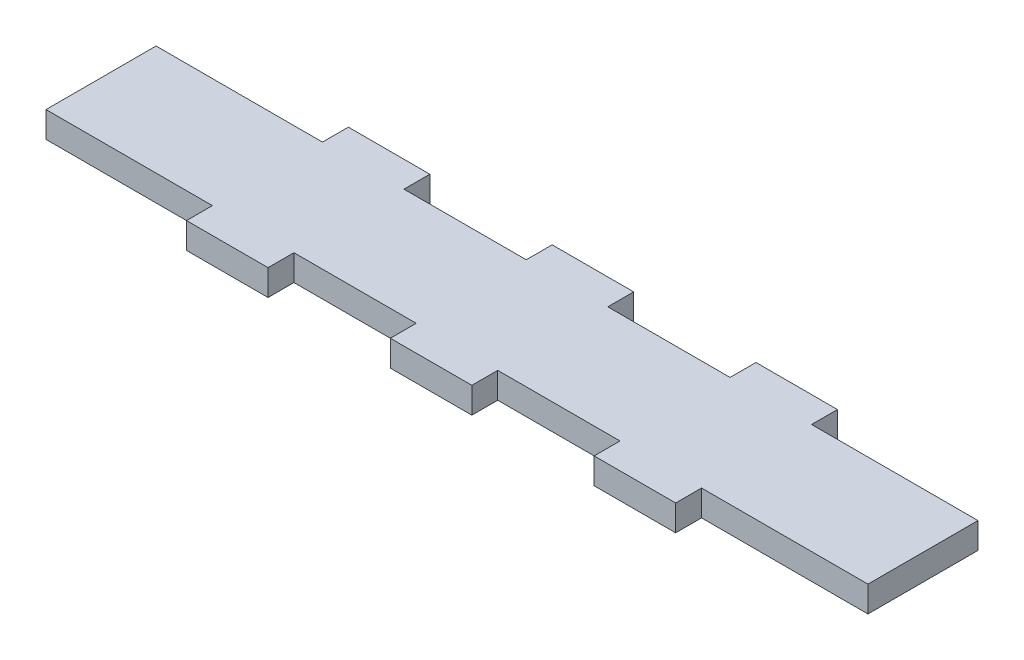
ISO-10303-21;
HEADER;
FILE_DESCRIPTION(('STEP AP214'),'2;1');
FILE_NAME('part.step','',(''),(''),'','','');
FILE_SCHEMA(('AUTOMOTIVE_DESIGN { 1 0 10303 214 1 1 1 1 }'));
ENDSEC;
DATA;
#1=APPLICATION_CONTEXT('core data for automotive mechanical design processes');
#2=APPLICATION_PROTOCOL_DEFINITION('international standard','automotive_design',2000,#1);
#3=PRODUCT_CONTEXT('',#1,'mechanical');
#4=PRODUCT('Part','Part','',(#3));
#5=PRODUCT_RELATED_PRODUCT_CATEGORY('part','',(#4));
#6=PRODUCT_DEFINITION_FORMATION('','',#4);
#7=PRODUCT_DEFINITION_CONTEXT('part definition',#1,'design');
#8=PRODUCT_DEFINITION('design','',#6,#7);
#9=PRODUCT_DEFINITION_SHAPE('','',#8);
#10=(LENGTH_UNIT() NAMED_UNIT(*) SI_UNIT(.MILLI.,.METRE.));
#11=(NAMED_UNIT(*) PLANE_ANGLE_UNIT() SI_UNIT($,.RADIAN.));
#12=(NAMED_UNIT(*) SI_UNIT($,.STERADIAN.) SOLID_ANGLE_UNIT());
#13=UNCERTAINTY_MEASURE_WITH_UNIT(LENGTH_MEASURE(1.E-05),#10,'distance_accuracy_value','');
#14=(GEOMETRIC_REPRESENTATION_CONTEXT(3) GLOBAL_UNCERTAINTY_ASSIGNED_CONTEXT((#13)) GLOBAL_UNIT_ASSIGNED_CONTEXT((#10,
#11,#12)) REPRESENTATION_CONTEXT('',''));
#15=CARTESIAN_POINT('',(0.,0.,0.));
#16=DIRECTION('',(0.,0.,1.));
#17=DIRECTION('',(1.,0.,0.));
#18=AXIS2_PLACEMENT_3D('',#15,#16,#17);
#19=CARTESIAN_POINT('',(60.,6.35,13.5));
#20=DIRECTION('',(0.,0.,-1.));
#21=DIRECTION('',(-1.,0.,0.));
#22=AXIS2_PLACEMENT_3D('',#19,#20,#21);
#23=PLANE('',#22);
#24=DIRECTION('',(1.,0.,0.));
#25=VECTOR('',#24,1.);
#26=CARTESIAN_POINT('',(60.,0.,13.5));
#27=LINE('',#26,#25);
#28=CARTESIAN_POINT('',(60.,0.,13.5));
#29=VERTEX_POINT('',#28);
#30=CARTESIAN_POINT('',(100.825,0.,13.5));
#31=VERTEX_POINT('',#30);
#32=EDGE_CURVE('E249',#29,#31,#27,.T.);
#33=ORIENTED_EDGE('',*,*,#32,.T.);
#34=DIRECTION('',(0.,-1.,0.));
#35=VECTOR('',#34,1.);
#36=CARTESIAN_POINT('',(100.825,6.35,13.5));
#37=LINE('',#36,#35);
#38=CARTESIAN_POINT('',(100.825,6.35,13.5));
#39=VERTEX_POINT('',#38);
#40=EDGE_CURVE('E11',#39,#31,#37,.T.);
#41=ORIENTED_EDGE('',*,*,#40,.F.);
#42=DIRECTION('',(1.,0.,0.));
#43=VECTOR('',#42,1.);
#44=CARTESIAN_POINT('',(60.,6.35,13.5));
#45=LINE('',#44,#43);
#46=CARTESIAN_POINT('',(60.,6.35,13.5));
#47=VERTEX_POINT('',#46);
#48=EDGE_CURVE('E303',#47,#39,#45,.T.);
#49=ORIENTED_EDGE('',*,*,#48,.F.);
#50=DIRECTION('',(0.,-1.,0.));
#51=VECTOR('',#50,1.);
#52=CARTESIAN_POINT('',(60.,6.35,13.5));
#53=LINE('',#52,#51);
#54=EDGE_CURVE('E245',#47,#29,#53,.T.);
#55=ORIENTED_EDGE('',*,*,#54,.T.);
#56=EDGE_LOOP('',(#33,#41,#49,#55));
#57=FACE_BOUND('',#56,.T.);
#58=ADVANCED_FACE('F33',(#57),#23,.F.);
#59=CARTESIAN_POINT('',(100.825,6.35,-13.5));
#60=DIRECTION('',(-1.,0.,0.));
#61=DIRECTION('',(0.,0.,1.));
#62=AXIS2_PLACEMENT_3D('',#59,#60,#61);
#63=PLANE('',#62);
#64=DIRECTION('',(0.,0.,-1.));
#65=VECTOR('',#64,1.);
#66=CARTESIAN_POINT('',(100.825,0.,-13.5));
#67=LINE('',#66,#65);
#68=CARTESIAN_POINT('',(100.825,0.,-13.5));
#69=VERTEX_POINT('',#68);
#70=EDGE_CURVE('E252',#31,#69,#67,.T.);
#71=ORIENTED_EDGE('',*,*,#70,.T.);
#72=DIRECTION('',(0.,-1.,0.));
#73=VECTOR('',#72,1.);
#74=CARTESIAN_POINT('',(100.825,6.35,-13.5));
#75=LINE('',#74,#73);
#76=CARTESIAN_POINT('',(100.825,6.35,-13.5));
#77=VERTEX_POINT('',#76);
#78=EDGE_CURVE('E41',#77,#69,#75,.T.);
#79=ORIENTED_EDGE('',*,*,#78,.F.);
#80=DIRECTION('',(0.,0.,-1.));
#81=VECTOR('',#80,1.);
#82=CARTESIAN_POINT('',(100.825,6.35,-13.5));
#83=LINE('',#82,#81);
#84=EDGE_CURVE('E152',#39,#77,#83,.T.);
#85=ORIENTED_EDGE('',*,*,#84,.F.);
#86=ORIENTED_EDGE('',*,*,#40,.T.);
#87=EDGE_LOOP('',(#71,#79,#85,#86));
#88=FACE_BOUND('',#87,.T.);
#89=ADVANCED_FACE('F461',(#88),#63,.F.);
#90=CARTESIAN_POINT('',(60.,6.35,-13.5));
#91=DIRECTION('',(0.,0.,1.));
#92=DIRECTION('',(1.,0.,0.));
#93=AXIS2_PLACEMENT_3D('',#90,#91,#92);
#94=PLANE('',#93);
#95=DIRECTION('',(-1.,0.,0.));
#96=VECTOR('',#95,1.);
#97=CARTESIAN_POINT('',(60.,0.,-13.5));
#98=LINE('',#97,#96);
#99=CARTESIAN_POINT('',(60.,0.,-13.5));
#100=VERTEX_POINT('',#99);
#101=EDGE_CURVE('E254',#69,#100,#98,.T.);
#102=ORIENTED_EDGE('',*,*,#101,.T.);
#103=DIRECTION('',(0.,-1.,0.));
#104=VECTOR('',#103,1.);
#105=CARTESIAN_POINT('',(60.,6.35,-13.5));
#106=LINE('',#105,#104);
#107=CARTESIAN_POINT('',(60.,6.35,-13.5));
#108=VERTEX_POINT('',#107);
#109=EDGE_CURVE('E370',#108,#100,#106,.T.);
#110=ORIENTED_EDGE('',*,*,#109,.F.);
#111=DIRECTION('',(-1.,0.,0.));
#112=VECTOR('',#111,1.);
#113=CARTESIAN_POINT('',(60.,6.35,-13.5));
#114=LINE('',#113,#112);
#115=EDGE_CURVE('E378',#77,#108,#114,.T.);
#116=ORIENTED_EDGE('',*,*,#115,.F.);
#117=ORIENTED_EDGE('',*,*,#78,.T.);
#118=EDGE_LOOP('',(#102,#110,#116,#117));
#119=FACE_BOUND('',#118,.T.);
#120=ADVANCED_FACE('F376',(#119),#94,.F.);
#121=CARTESIAN_POINT('',(60.,6.35,-19.85));
#122=DIRECTION('',(-1.,0.,0.));
#123=DIRECTION('',(0.,0.,1.));
#124=AXIS2_PLACEMENT_3D('',#121,#122,#123);
#125=PLANE('',#124);
#126=DIRECTION('',(0.,0.,-1.));
#127=VECTOR('',#126,1.);
#128=CARTESIAN_POINT('',(60.,0.,-19.85));
#129=LINE('',#128,#127);
#130=CARTESIAN_POINT('',(60.,0.,-19.85));
#131=VERTEX_POINT('',#130);
#132=EDGE_CURVE('E256',#100,#131,#129,.T.);
#133=ORIENTED_EDGE('',*,*,#132,.T.);
#134=DIRECTION('',(0.,-1.,0.));
#135=VECTOR('',#134,1.);
#136=CARTESIAN_POINT('',(60.,6.35,-19.85));
#137=LINE('',#136,#135);
#138=CARTESIAN_POINT('',(60.,6.35,-19.85));
#139=VERTEX_POINT('',#138);
#140=EDGE_CURVE('E367',#139,#131,#137,.T.);
#141=ORIENTED_EDGE('',*,*,#140,.F.);
#142=DIRECTION('',(0.,0.,-1.));
#143=VECTOR('',#142,1.);
#144=CARTESIAN_POINT('',(60.,6.35,-19.85));
#145=LINE('',#144,#143);
#146=EDGE_CURVE('E396',#108,#139,#145,.T.);
#147=ORIENTED_EDGE('',*,*,#146,.F.);
#148=ORIENTED_EDGE('',*,*,#109,.T.);
#149=EDGE_LOOP('',(#133,#141,#147,#148));
#150=FACE_BOUND('',#149,.T.);
#151=ADVANCED_FACE('F387',(#150),#125,.F.);
#152=CARTESIAN_POINT('',(40.,6.35,-19.85));
#153=DIRECTION('',(0.,0.,1.));
#154=DIRECTION('',(1.,0.,0.));
#155=AXIS2_PLACEMENT_3D('',#152,#153,#154);
#156=PLANE('',#155);
#157=DIRECTION('',(-1.,0.,0.));
#158=VECTOR('',#157,1.);
#159=CARTESIAN_POINT('',(40.,0.,-19.85));
#160=LINE('',#159,#158);
#161=CARTESIAN_POINT('',(40.,0.,-19.85));
#162=VERTEX_POINT('',#161);
#163=EDGE_CURVE('E258',#131,#162,#160,.T.);
#164=ORIENTED_EDGE('',*,*,#163,.T.);
#165=DIRECTION('',(0.,-1.,0.));
#166=VECTOR('',#165,1.);
#167=CARTESIAN_POINT('',(40.,6.35,-19.85));
#168=LINE('',#167,#166);
#169=CARTESIAN_POINT('',(40.,6.35,-19.85));
#170=VERTEX_POINT('',#169);
#171=EDGE_CURVE('E364',#170,#162,#168,.T.);
#172=ORIENTED_EDGE('',*,*,#171,.F.);
#173=DIRECTION('',(-1.,0.,0.));
#174=VECTOR('',#173,1.);
#175=CARTESIAN_POINT('',(40.,6.35,-19.85));
#176=LINE('',#175,#174);
#177=EDGE_CURVE('E393',#139,#170,#176,.T.);
#178=ORIENTED_EDGE('',*,*,#177,.F.);
#179=ORIENTED_EDGE('',*,*,#140,.T.);
#180=EDGE_LOOP('',(#164,#172,#178,#179));
#181=FACE_BOUND('',#180,.T.);
#182=ADVANCED_FACE('F391',(#181),#156,.F.);
#183=CARTESIAN_POINT('',(40.,6.35,-13.5));
#184=DIRECTION('',(1.,0.,0.));
#185=DIRECTION('',(0.,0.,-1.));
#186=AXIS2_PLACEMENT_3D('',#183,#184,#185);
#187=PLANE('',#186);
#188=DIRECTION('',(0.,0.,1.));
#189=VECTOR('',#188,1.);
#190=CARTESIAN_POINT('',(40.,0.,-13.5));
#191=LINE('',#190,#189);
#192=CARTESIAN_POINT('',(40.,0.,-13.5));
#193=VERTEX_POINT('',#192);
#194=EDGE_CURVE('E260',#162,#193,#191,.T.);
#195=ORIENTED_EDGE('',*,*,#194,.T.);
#196=DIRECTION('',(0.,-1.,0.));
#197=VECTOR('',#196,1.);
#198=CARTESIAN_POINT('',(40.,6.35,-13.5));
#199=LINE('',#198,#197);
#200=CARTESIAN_POINT('',(40.,6.35,-13.5));
#201=VERTEX_POINT('',#200);
#202=EDGE_CURVE('E361',#201,#193,#199,.T.);
#203=ORIENTED_EDGE('',*,*,#202,.F.);
#204=DIRECTION('',(0.,0.,1.));
#205=VECTOR('',#204,1.);
#206=CARTESIAN_POINT('',(40.,6.35,-13.5));
#207=LINE('',#206,#205);
#208=EDGE_CURVE('E395',#170,#201,#207,.T.);
#209=ORIENTED_EDGE('',*,*,#208,.F.);
#210=ORIENTED_EDGE('',*,*,#171,.T.);
#211=EDGE_LOOP('',(#195,#203,#209,#210));
#212=FACE_BOUND('',#211,.T.);
#213=ADVANCED_FACE('F474',(#212),#187,.F.);
#214=CARTESIAN_POINT('',(10.,6.35,-13.5));
#215=DIRECTION('',(0.,0.,1.));
#216=DIRECTION('',(1.,0.,0.));
#217=AXIS2_PLACEMENT_3D('',#214,#215,#216);
#218=PLANE('',#217);
#219=DIRECTION('',(-1.,0.,0.));
#220=VECTOR('',#219,1.);
#221=CARTESIAN_POINT('',(10.,0.,-13.5));
#222=LINE('',#221,#220);
#223=CARTESIAN_POINT('',(10.,0.,-13.5));
#224=VERTEX_POINT('',#223);
#225=EDGE_CURVE('E262',#193,#224,#222,.T.);
#226=ORIENTED_EDGE('',*,*,#225,.T.);
#227=DIRECTION('',(0.,-1.,0.));
#228=VECTOR('',#227,1.);
#229=CARTESIAN_POINT('',(10.,6.35,-13.5));
#230=LINE('',#229,#228);
#231=CARTESIAN_POINT('',(10.,6.35,-13.5));
#232=VERTEX_POINT('',#231);
#233=EDGE_CURVE('E358',#232,#224,#230,.T.);
#234=ORIENTED_EDGE('',*,*,#233,.F.);
#235=DIRECTION('',(-1.,0.,0.));
#236=VECTOR('',#235,1.);
#237=CARTESIAN_POINT('',(10.,6.35,-13.5));
#238=LINE('',#237,#236);
#239=EDGE_CURVE('E398',#201,#232,#238,.T.);
#240=ORIENTED_EDGE('',*,*,#239,.F.);
#241=ORIENTED_EDGE('',*,*,#202,.T.);
#242=EDGE_LOOP('',(#226,#234,#240,#241));
#243=FACE_BOUND('',#242,.T.);
#244=ADVANCED_FACE('F477',(#243),#218,.F.);
#245=CARTESIAN_POINT('',(10.,6.35,-19.85));
#246=DIRECTION('',(-1.,0.,0.));
#247=DIRECTION('',(0.,0.,1.));
#248=AXIS2_PLACEMENT_3D('',#245,#246,#247);
#249=PLANE('',#248);
#250=DIRECTION('',(0.,0.,-1.));
#251=VECTOR('',#250,1.);
#252=CARTESIAN_POINT('',(10.,0.,-19.85));
#253=LINE('',#252,#251);
#254=CARTESIAN_POINT('',(10.,0.,-19.85));
#255=VERTEX_POINT('',#254);
#256=EDGE_CURVE('E264',#224,#255,#253,.T.);
#257=ORIENTED_EDGE('',*,*,#256,.T.);
#258=DIRECTION('',(0.,-1.,0.));
#259=VECTOR('',#258,1.);
#260=CARTESIAN_POINT('',(10.,6.35,-19.85));
#261=LINE('',#260,#259);
#262=CARTESIAN_POINT('',(10.,6.35,-19.85));
#263=VERTEX_POINT('',#262);
#264=EDGE_CURVE('E355',#263,#255,#261,.T.);
#265=ORIENTED_EDGE('',*,*,#264,.F.);
#266=DIRECTION('',(0.,0.,-1.));
#267=VECTOR('',#266,1.);
#268=CARTESIAN_POINT('',(10.,6.35,-19.85));
#269=LINE('',#268,#267);
#270=EDGE_CURVE('E404',#232,#263,#269,.T.);
#271=ORIENTED_EDGE('',*,*,#270,.F.);
#272=ORIENTED_EDGE('',*,*,#233,.T.);
#273=EDGE_LOOP('',(#257,#265,#271,#272));
#274=FACE_BOUND('',#273,.T.);
#275=ADVANCED_FACE('F481',(#274),#249,.F.);
#276=CARTESIAN_POINT('',(-10.,6.35,-19.85));
#277=DIRECTION('',(0.,0.,1.));
#278=DIRECTION('',(1.,0.,0.));
#279=AXIS2_PLACEMENT_3D('',#276,#277,#278);
#280=PLANE('',#279);
#281=DIRECTION('',(-1.,0.,0.));
#282=VECTOR('',#281,1.);
#283=CARTESIAN_POINT('',(-10.,0.,-19.85));
#284=LINE('',#283,#282);
#285=CARTESIAN_POINT('',(-10.,0.,-19.85));
#286=VERTEX_POINT('',#285);
#287=EDGE_CURVE('E266',#255,#286,#284,.T.);
#288=ORIENTED_EDGE('',*,*,#287,.T.);
#289=DIRECTION('',(0.,-1.,0.));
#290=VECTOR('',#289,1.);
#291=CARTESIAN_POINT('',(-10.,6.35,-19.85));
#292=LINE('',#291,#290);
#293=CARTESIAN_POINT('',(-10.,6.35,-19.85));
#294=VERTEX_POINT('',#293);
#295=EDGE_CURVE('E352',#294,#286,#292,.T.);
#296=ORIENTED_EDGE('',*,*,#295,.F.);
#297=DIRECTION('',(-1.,0.,0.));
#298=VECTOR('',#297,1.);
#299=CARTESIAN_POINT('',(-10.,6.35,-19.85));
#300=LINE('',#299,#298);
#301=EDGE_CURVE('E406',#263,#294,#300,.T.);
#302=ORIENTED_EDGE('',*,*,#301,.F.);
#303=ORIENTED_EDGE('',*,*,#264,.T.);
#304=EDGE_LOOP('',(#288,#296,#302,#303));
#305=FACE_BOUND('',#304,.T.);
#306=ADVANCED_FACE('F485',(#305),#280,.F.);
#307=CARTESIAN_POINT('',(-10.,6.35,-13.5));
#308=DIRECTION('',(1.,0.,0.));
#309=DIRECTION('',(0.,0.,-1.));
#310=AXIS2_PLACEMENT_3D('',#307,#308,#309);
#311=PLANE('',#310);
#312=DIRECTION('',(0.,0.,1.));
#313=VECTOR('',#312,1.);
#314=CARTESIAN_POINT('',(-10.,0.,-13.5));
#315=LINE('',#314,#313);
#316=CARTESIAN_POINT('',(-10.,0.,-13.5));
#317=VERTEX_POINT('',#316);
#318=EDGE_CURVE('E268',#286,#317,#315,.T.);
#319=ORIENTED_EDGE('',*,*,#318,.T.);
#320=DIRECTION('',(0.,-1.,0.));
#321=VECTOR('',#320,1.);
#322=CARTESIAN_POINT('',(-10.,6.35,-13.5));
#323=LINE('',#322,#321);
#324=CARTESIAN_POINT('',(-10.,6.35,-13.5));
#325=VERTEX_POINT('',#324);
#326=EDGE_CURVE('E349',#325,#317,#323,.T.);
#327=ORIENTED_EDGE('',*,*,#326,.F.);
#328=DIRECTION('',(0.,0.,1.));
#329=VECTOR('',#328,1.);
#330=CARTESIAN_POINT('',(-10.,6.35,-13.5));
#331=LINE('',#330,#329);
#332=EDGE_CURVE('E408',#294,#325,#331,.T.);
#333=ORIENTED_EDGE('',*,*,#332,.F.);
#334=ORIENTED_EDGE('',*,*,#295,.T.);
#335=EDGE_LOOP('',(#319,#327,#333,#334));
#336=FACE_BOUND('',#335,.T.);
#337=ADVANCED_FACE('F489',(#336),#311,.F.);
#338=CARTESIAN_POINT('',(-40.,6.35,-13.5));
#339=DIRECTION('',(0.,0.,1.));
#340=DIRECTION('',(1.,0.,0.));
#341=AXIS2_PLACEMENT_3D('',#338,#339,#340);
#342=PLANE('',#341);
#343=DIRECTION('',(-1.,0.,0.));
#344=VECTOR('',#343,1.);
#345=CARTESIAN_POINT('',(-40.,0.,-13.5));
#346=LINE('',#345,#344);
#347=CARTESIAN_POINT('',(-40.,0.,-13.5));
#348=VERTEX_POINT('',#347);
#349=EDGE_CURVE('E270',#317,#348,#346,.T.);
#350=ORIENTED_EDGE('',*,*,#349,.T.);
#351=DIRECTION('',(0.,-1.,0.));
#352=VECTOR('',#351,1.);
#353=CARTESIAN_POINT('',(-40.,6.35,-13.5));
#354=LINE('',#353,#352);
#355=CARTESIAN_POINT('',(-40.,6.35,-13.5));
#356=VERTEX_POINT('',#355);
#357=EDGE_CURVE('E346',#356,#348,#354,.T.);
#358=ORIENTED_EDGE('',*,*,#357,.F.);
#359=DIRECTION('',(-1.,0.,0.));
#360=VECTOR('',#359,1.);
#361=CARTESIAN_POINT('',(-40.,6.35,-13.5));
#362=LINE('',#361,#360);
#363=EDGE_CURVE('E410',#325,#356,#362,.T.);
#364=ORIENTED_EDGE('',*,*,#363,.F.);
#365=ORIENTED_EDGE('',*,*,#326,.T.);
#366=EDGE_LOOP('',(#350,#358,#364,#365));
#367=FACE_BOUND('',#366,.T.);
#368=ADVANCED_FACE('F493',(#367),#342,.F.);
#369=CARTESIAN_POINT('',(-40.,6.35,-19.85));
#370=DIRECTION('',(-1.,0.,0.));
#371=DIRECTION('',(0.,0.,1.));
#372=AXIS2_PLACEMENT_3D('',#369,#370,#371);
#373=PLANE('',#372);
#374=DIRECTION('',(0.,0.,-1.));
#375=VECTOR('',#374,1.);
#376=CARTESIAN_POINT('',(-40.,0.,-19.85));
#377=LINE('',#376,#375);
#378=CARTESIAN_POINT('',(-40.,0.,-19.85));
#379=VERTEX_POINT('',#378);
#380=EDGE_CURVE('E272',#348,#379,#377,.T.);
#381=ORIENTED_EDGE('',*,*,#380,.T.);
#382=DIRECTION('',(0.,-1.,0.));
#383=VECTOR('',#382,1.);
#384=CARTESIAN_POINT('',(-40.,6.35,-19.85));
#385=LINE('',#384,#383);
#386=CARTESIAN_POINT('',(-40.,6.35,-19.85));
#387=VERTEX_POINT('',#386);
#388=EDGE_CURVE('E343',#387,#379,#385,.T.);
#389=ORIENTED_EDGE('',*,*,#388,.F.);
#390=DIRECTION('',(0.,0.,-1.));
#391=VECTOR('',#390,1.);
#392=CARTESIAN_POINT('',(-40.,6.35,-19.85));
#393=LINE('',#392,#391);
#394=EDGE_CURVE('E412',#356,#387,#393,.T.);
#395=ORIENTED_EDGE('',*,*,#394,.F.);
#396=ORIENTED_EDGE('',*,*,#357,.T.);
#397=EDGE_LOOP('',(#381,#389,#395,#396));
#398=FACE_BOUND('',#397,.T.);
#399=ADVANCED_FACE('F497',(#398),#373,.F.);
#400=CARTESIAN_POINT('',(-60.,6.35,-19.85));
#401=DIRECTION('',(0.,0.,1.));
#402=DIRECTION('',(1.,0.,0.));
#403=AXIS2_PLACEMENT_3D('',#400,#401,#402);
#404=PLANE('',#403);
#405=DIRECTION('',(-1.,0.,0.));
#406=VECTOR('',#405,1.);
#407=CARTESIAN_POINT('',(-60.,0.,-19.85));
#408=LINE('',#407,#406);
#409=CARTESIAN_POINT('',(-60.,0.,-19.85));
#410=VERTEX_POINT('',#409);
#411=EDGE_CURVE('E274',#379,#410,#408,.T.);
#412=ORIENTED_EDGE('',*,*,#411,.T.);
#413=DIRECTION('',(0.,-1.,0.));
#414=VECTOR('',#413,1.);
#415=CARTESIAN_POINT('',(-60.,6.35,-19.85));
#416=LINE('',#415,#414);
#417=CARTESIAN_POINT('',(-60.,6.35,-19.85));
#418=VERTEX_POINT('',#417);
#419=EDGE_CURVE('E340',#418,#410,#416,.T.);
#420=ORIENTED_EDGE('',*,*,#419,.F.);
#421=DIRECTION('',(-1.,0.,0.));
#422=VECTOR('',#421,1.);
#423=CARTESIAN_POINT('',(-60.,6.35,-19.85));
#424=LINE('',#423,#422);
#425=EDGE_CURVE('E414',#387,#418,#424,.T.);
#426=ORIENTED_EDGE('',*,*,#425,.F.);
#427=ORIENTED_EDGE('',*,*,#388,.T.);
#428=EDGE_LOOP('',(#412,#420,#426,#427));
#429=FACE_BOUND('',#428,.T.);
#430=ADVANCED_FACE('F501',(#429),#404,.F.);
#431=CARTESIAN_POINT('',(-60.,6.35,-13.5));
#432=DIRECTION('',(1.,0.,0.));
#433=DIRECTION('',(0.,0.,-1.));
#434=AXIS2_PLACEMENT_3D('',#431,#432,#433);
#435=PLANE('',#434);
#436=DIRECTION('',(0.,0.,1.));
#437=VECTOR('',#436,1.);
#438=CARTESIAN_POINT('',(-60.,0.,-13.5));
#439=LINE('',#438,#437);
#440=CARTESIAN_POINT('',(-60.,0.,-13.5));
#441=VERTEX_POINT('',#440);
#442=EDGE_CURVE('E276',#410,#441,#439,.T.);
#443=ORIENTED_EDGE('',*,*,#442,.T.);
#444=DIRECTION('',(0.,-1.,0.));
#445=VECTOR('',#444,1.);
#446=CARTESIAN_POINT('',(-60.,6.35,-13.5));
#447=LINE('',#446,#445);
#448=CARTESIAN_POINT('',(-60.,6.35,-13.5));
#449=VERTEX_POINT('',#448);
#450=EDGE_CURVE('E337',#449,#441,#447,.T.);
#451=ORIENTED_EDGE('',*,*,#450,.F.);
#452=DIRECTION('',(0.,0.,1.));
#453=VECTOR('',#452,1.);
#454=CARTESIAN_POINT('',(-60.,6.35,-13.5));
#455=LINE('',#454,#453);
#456=EDGE_CURVE('E416',#418,#449,#455,.T.);
#457=ORIENTED_EDGE('',*,*,#456,.F.);
#458=ORIENTED_EDGE('',*,*,#419,.T.);
#459=EDGE_LOOP('',(#443,#451,#457,#458));
#460=FACE_BOUND('',#459,.T.);
#461=ADVANCED_FACE('F505',(#460),#435,.F.);
#462=CARTESIAN_POINT('',(-100.825,6.35,-13.5));
#463=DIRECTION('',(0.,0.,1.));
#464=DIRECTION('',(1.,0.,0.));
#465=AXIS2_PLACEMENT_3D('',#462,#463,#464);
#466=PLANE('',#465);
#467=DIRECTION('',(-1.,0.,0.));
#468=VECTOR('',#467,1.);
#469=CARTESIAN_POINT('',(-100.825,0.,-13.5));
#470=LINE('',#469,#468);
#471=CARTESIAN_POINT('',(-100.825,0.,-13.5));
#472=VERTEX_POINT('',#471);
#473=EDGE_CURVE('E278',#441,#472,#470,.T.);
#474=ORIENTED_EDGE('',*,*,#473,.T.);
#475=DIRECTION('',(0.,-1.,0.));
#476=VECTOR('',#475,1.);
#477=CARTESIAN_POINT('',(-100.825,6.35,-13.5));
#478=LINE('',#477,#476);
#479=CARTESIAN_POINT('',(-100.825,6.35,-13.5));
#480=VERTEX_POINT('',#479);
#481=EDGE_CURVE('E334',#480,#472,#478,.T.);
#482=ORIENTED_EDGE('',*,*,#481,.F.);
#483=DIRECTION('',(-1.,0.,0.));
#484=VECTOR('',#483,1.);
#485=CARTESIAN_POINT('',(-100.825,6.35,-13.5));
#486=LINE('',#485,#484);
#487=EDGE_CURVE('E418',#449,#480,#486,.T.);
#488=ORIENTED_EDGE('',*,*,#487,.F.);
#489=ORIENTED_EDGE('',*,*,#450,.T.);
#490=EDGE_LOOP('',(#474,#482,#488,#489));
#491=FACE_BOUND('',#490,.T.);
#492=ADVANCED_FACE('F509',(#491),#466,.F.);
#493=CARTESIAN_POINT('',(-100.825,6.35,-13.5));
#494=DIRECTION('',(1.,0.,0.));
#495=DIRECTION('',(0.,0.,-1.));
#496=AXIS2_PLACEMENT_3D('',#493,#494,#495);
#497=PLANE('',#496);
#498=DIRECTION('',(0.,0.,1.));
#499=VECTOR('',#498,1.);
#500=CARTESIAN_POINT('',(-100.825,0.,-13.5));
#501=LINE('',#500,#499);
#502=CARTESIAN_POINT('',(-100.825,0.,13.5));
#503=VERTEX_POINT('',#502);
#504=EDGE_CURVE('E280',#472,#503,#501,.T.);
#505=ORIENTED_EDGE('',*,*,#504,.T.);
#506=DIRECTION('',(0.,-1.,0.));
#507=VECTOR('',#506,1.);
#508=CARTESIAN_POINT('',(-100.825,6.35,13.5));
#509=LINE('',#508,#507);
#510=CARTESIAN_POINT('',(-100.825,6.35,13.5));
#511=VERTEX_POINT('',#510);
#512=EDGE_CURVE('E331',#511,#503,#509,.T.);
#513=ORIENTED_EDGE('',*,*,#512,.F.);
#514=DIRECTION('',(0.,0.,1.));
#515=VECTOR('',#514,1.);
#516=CARTESIAN_POINT('',(-100.825,6.35,-13.5));
#517=LINE('',#516,#515);
#518=EDGE_CURVE('E420',#480,#511,#517,.T.);
#519=ORIENTED_EDGE('',*,*,#518,.F.);
#520=ORIENTED_EDGE('',*,*,#481,.T.);
#521=EDGE_LOOP('',(#505,#513,#519,#520));
#522=FACE_BOUND('',#521,.T.);
#523=ADVANCED_FACE('F513',(#522),#497,.F.);
#524=CARTESIAN_POINT('',(-100.825,6.35,13.5));
#525=DIRECTION('',(0.,0.,-1.));
#526=DIRECTION('',(-1.,0.,0.));
#527=AXIS2_PLACEMENT_3D('',#524,#525,#526);
#528=PLANE('',#527);
#529=DIRECTION('',(1.,0.,0.));
#530=VECTOR('',#529,1.);
#531=CARTESIAN_POINT('',(-100.825,0.,13.5));
#532=LINE('',#531,#530);
#533=CARTESIAN_POINT('',(-60.,0.,13.5));
#534=VERTEX_POINT('',#533);
#535=EDGE_CURVE('E282',#503,#534,#532,.T.);
#536=ORIENTED_EDGE('',*,*,#535,.T.);
#537=DIRECTION('',(0.,-1.,0.));
#538=VECTOR('',#537,1.);
#539=CARTESIAN_POINT('',(-60.,6.35,13.5));
#540=LINE('',#539,#538);
#541=CARTESIAN_POINT('',(-60.,6.35,13.5));
#542=VERTEX_POINT('',#541);
#543=EDGE_CURVE('E328',#542,#534,#540,.T.);
#544=ORIENTED_EDGE('',*,*,#543,.F.);
#545=DIRECTION('',(1.,0.,0.));
#546=VECTOR('',#545,1.);
#547=CARTESIAN_POINT('',(-100.825,6.35,13.5));
#548=LINE('',#547,#546);
#549=EDGE_CURVE('E422',#511,#542,#548,.T.);
#550=ORIENTED_EDGE('',*,*,#549,.F.);
#551=ORIENTED_EDGE('',*,*,#512,.T.);
#552=EDGE_LOOP('',(#536,#544,#550,#551));
#553=FACE_BOUND('',#552,.T.);
#554=ADVANCED_FACE('F517',(#553),#528,.F.);
#555=CARTESIAN_POINT('',(-60.,6.35,13.5));
#556=DIRECTION('',(1.,0.,0.));
#557=DIRECTION('',(0.,0.,-1.));
#558=AXIS2_PLACEMENT_3D('',#555,#556,#557);
#559=PLANE('',#558);
#560=DIRECTION('',(0.,0.,1.));
#561=VECTOR('',#560,1.);
#562=CARTESIAN_POINT('',(-60.,0.,13.5));
#563=LINE('',#562,#561);
#564=CARTESIAN_POINT('',(-60.,0.,19.85));
#565=VERTEX_POINT('',#564);
#566=EDGE_CURVE('E284',#534,#565,#563,.T.);
#567=ORIENTED_EDGE('',*,*,#566,.T.);
#568=DIRECTION('',(0.,-1.,0.));
#569=VECTOR('',#568,1.);
#570=CARTESIAN_POINT('',(-60.,6.35,19.85));
#571=LINE('',#570,#569);
#572=CARTESIAN_POINT('',(-60.,6.35,19.85));
#573=VERTEX_POINT('',#572);
#574=EDGE_CURVE('E325',#573,#565,#571,.T.);
#575=ORIENTED_EDGE('',*,*,#574,.F.);
#576=DIRECTION('',(0.,0.,1.));
#577=VECTOR('',#576,1.);
#578=CARTESIAN_POINT('',(-60.,6.35,13.5));
#579=LINE('',#578,#577);
#580=EDGE_CURVE('E424',#542,#573,#579,.T.);
#581=ORIENTED_EDGE('',*,*,#580,.F.);
#582=ORIENTED_EDGE('',*,*,#543,.T.);
#583=EDGE_LOOP('',(#567,#575,#581,#582));
#584=FACE_BOUND('',#583,.T.);
#585=ADVANCED_FACE('F521',(#584),#559,.F.);
#586=CARTESIAN_POINT('',(-60.,6.35,19.85));
#587=DIRECTION('',(0.,0.,-1.));
#588=DIRECTION('',(-1.,0.,0.));
#589=AXIS2_PLACEMENT_3D('',#586,#587,#588);
#590=PLANE('',#589);
#591=DIRECTION('',(1.,0.,0.));
#592=VECTOR('',#591,1.);
#593=CARTESIAN_POINT('',(-60.,0.,19.85));
#594=LINE('',#593,#592);
#595=CARTESIAN_POINT('',(-40.,0.,19.85));
#596=VERTEX_POINT('',#595);
#597=EDGE_CURVE('E286',#565,#596,#594,.T.);
#598=ORIENTED_EDGE('',*,*,#597,.T.);
#599=DIRECTION('',(0.,-1.,0.));
#600=VECTOR('',#599,1.);
#601=CARTESIAN_POINT('',(-40.,6.35,19.85));
#602=LINE('',#601,#600);
#603=CARTESIAN_POINT('',(-40.,6.35,19.85));
#604=VERTEX_POINT('',#603);
#605=EDGE_CURVE('E322',#604,#596,#602,.T.);
#606=ORIENTED_EDGE('',*,*,#605,.F.);
#607=DIRECTION('',(1.,0.,0.));
#608=VECTOR('',#607,1.);
#609=CARTESIAN_POINT('',(-60.,6.35,19.85));
#610=LINE('',#609,#608);
#611=EDGE_CURVE('E426',#573,#604,#610,.T.);
#612=ORIENTED_EDGE('',*,*,#611,.F.);
#613=ORIENTED_EDGE('',*,*,#574,.T.);
#614=EDGE_LOOP('',(#598,#606,#612,#613));
#615=FACE_BOUND('',#614,.T.);
#616=ADVANCED_FACE('F525',(#615),#590,.F.);
#617=CARTESIAN_POINT('',(-40.,6.35,19.85));
#618=DIRECTION('',(-1.,0.,0.));
#619=DIRECTION('',(0.,0.,1.));
#620=AXIS2_PLACEMENT_3D('',#617,#618,#619);
#621=PLANE('',#620);
#622=DIRECTION('',(0.,0.,-1.));
#623=VECTOR('',#622,1.);
#624=CARTESIAN_POINT('',(-40.,0.,19.85));
#625=LINE('',#624,#623);
#626=CARTESIAN_POINT('',(-40.,0.,13.5));
#627=VERTEX_POINT('',#626);
#628=EDGE_CURVE('E288',#596,#627,#625,.T.);
#629=ORIENTED_EDGE('',*,*,#628,.T.);
#630=DIRECTION('',(0.,-1.,0.));
#631=VECTOR('',#630,1.);
#632=CARTESIAN_POINT('',(-40.,6.35,13.5));
#633=LINE('',#632,#631);
#634=CARTESIAN_POINT('',(-40.,6.35,13.5));
#635=VERTEX_POINT('',#634);
#636=EDGE_CURVE('E319',#635,#627,#633,.T.);
#637=ORIENTED_EDGE('',*,*,#636,.F.);
#638=DIRECTION('',(0.,0.,-1.));
#639=VECTOR('',#638,1.);
#640=CARTESIAN_POINT('',(-40.,6.35,19.85));
#641=LINE('',#640,#639);
#642=EDGE_CURVE('E428',#604,#635,#641,.T.);
#643=ORIENTED_EDGE('',*,*,#642,.F.);
#644=ORIENTED_EDGE('',*,*,#605,.T.);
#645=EDGE_LOOP('',(#629,#637,#643,#644));
#646=FACE_BOUND('',#645,.T.);
#647=ADVANCED_FACE('F529',(#646),#621,.F.);
#648=CARTESIAN_POINT('',(-40.,6.35,13.5));
#649=DIRECTION('',(0.,0.,-1.));
#650=DIRECTION('',(-1.,0.,0.));
#651=AXIS2_PLACEMENT_3D('',#648,#649,#650);
#652=PLANE('',#651);
#653=DIRECTION('',(1.,0.,0.));
#654=VECTOR('',#653,1.);
#655=CARTESIAN_POINT('',(-40.,0.,13.5));
#656=LINE('',#655,#654);
#657=CARTESIAN_POINT('',(-10.,0.,13.5));
#658=VERTEX_POINT('',#657);
#659=EDGE_CURVE('E290',#627,#658,#656,.T.);
#660=ORIENTED_EDGE('',*,*,#659,.T.);
#661=DIRECTION('',(0.,-1.,0.));
#662=VECTOR('',#661,1.);
#663=CARTESIAN_POINT('',(-10.,6.35,13.5));
#664=LINE('',#663,#662);
#665=CARTESIAN_POINT('',(-10.,6.35,13.5));
#666=VERTEX_POINT('',#665);
#667=EDGE_CURVE('E316',#666,#658,#664,.T.);
#668=ORIENTED_EDGE('',*,*,#667,.F.);
#669=DIRECTION('',(1.,0.,0.));
#670=VECTOR('',#669,1.);
#671=CARTESIAN_POINT('',(-40.,6.35,13.5));
#672=LINE('',#671,#670);
#673=EDGE_CURVE('E430',#635,#666,#672,.T.);
#674=ORIENTED_EDGE('',*,*,#673,.F.);
#675=ORIENTED_EDGE('',*,*,#636,.T.);
#676=EDGE_LOOP('',(#660,#668,#674,#675));
#677=FACE_BOUND('',#676,.T.);
#678=ADVANCED_FACE('F533',(#677),#652,.F.);
#679=CARTESIAN_POINT('',(-10.,6.35,13.5));
#680=DIRECTION('',(1.,0.,0.));
#681=DIRECTION('',(0.,0.,-1.));
#682=AXIS2_PLACEMENT_3D('',#679,#680,#681);
#683=PLANE('',#682);
#684=DIRECTION('',(0.,0.,1.));
#685=VECTOR('',#684,1.);
#686=CARTESIAN_POINT('',(-10.,0.,13.5));
#687=LINE('',#686,#685);
#688=CARTESIAN_POINT('',(-10.,0.,19.85));
#689=VERTEX_POINT('',#688);
#690=EDGE_CURVE('E292',#658,#689,#687,.T.);
#691=ORIENTED_EDGE('',*,*,#690,.T.);
#692=DIRECTION('',(0.,-1.,0.));
#693=VECTOR('',#692,1.);
#694=CARTESIAN_POINT('',(-10.,6.35,19.85));
#695=LINE('',#694,#693);
#696=CARTESIAN_POINT('',(-10.,6.35,19.85));
#697=VERTEX_POINT('',#696);
#698=EDGE_CURVE('E313',#697,#689,#695,.T.);
#699=ORIENTED_EDGE('',*,*,#698,.F.);
#700=DIRECTION('',(0.,0.,1.));
#701=VECTOR('',#700,1.);
#702=CARTESIAN_POINT('',(-10.,6.35,13.5));
#703=LINE('',#702,#701);
#704=EDGE_CURVE('E432',#666,#697,#703,.T.);
#705=ORIENTED_EDGE('',*,*,#704,.F.);
#706=ORIENTED_EDGE('',*,*,#667,.T.);
#707=EDGE_LOOP('',(#691,#699,#705,#706));
#708=FACE_BOUND('',#707,.T.);
#709=ADVANCED_FACE('F537',(#708),#683,.F.);
#710=CARTESIAN_POINT('',(-10.,6.35,19.85));
#711=DIRECTION('',(0.,0.,-1.));
#712=DIRECTION('',(-1.,0.,0.));
#713=AXIS2_PLACEMENT_3D('',#710,#711,#712);
#714=PLANE('',#713);
#715=DIRECTION('',(1.,0.,0.));
#716=VECTOR('',#715,1.);
#717=CARTESIAN_POINT('',(-10.,0.,19.85));
#718=LINE('',#717,#716);
#719=CARTESIAN_POINT('',(10.,0.,19.85));
#720=VERTEX_POINT('',#719);
#721=EDGE_CURVE('E294',#689,#720,#718,.T.);
#722=ORIENTED_EDGE('',*,*,#721,.T.);
#723=DIRECTION('',(0.,-1.,0.));
#724=VECTOR('',#723,1.);
#725=CARTESIAN_POINT('',(10.,6.35,19.85));
#726=LINE('',#725,#724);
#727=CARTESIAN_POINT('',(10.,6.35,19.85));
#728=VERTEX_POINT('',#727);
#729=EDGE_CURVE('E310',#728,#720,#726,.T.);
#730=ORIENTED_EDGE('',*,*,#729,.F.);
#731=DIRECTION('',(1.,0.,0.));
#732=VECTOR('',#731,1.);
#733=CARTESIAN_POINT('',(-10.,6.35,19.85));
#734=LINE('',#733,#732);
#735=EDGE_CURVE('E434',#697,#728,#734,.T.);
#736=ORIENTED_EDGE('',*,*,#735,.F.);
#737=ORIENTED_EDGE('',*,*,#698,.T.);
#738=EDGE_LOOP('',(#722,#730,#736,#737));
#739=FACE_BOUND('',#738,.T.);
#740=ADVANCED_FACE('F541',(#739),#714,.F.);
#741=CARTESIAN_POINT('',(10.,6.35,19.85));
#742=DIRECTION('',(-1.,0.,0.));
#743=DIRECTION('',(0.,0.,1.));
#744=AXIS2_PLACEMENT_3D('',#741,#742,#743);
#745=PLANE('',#744);
#746=DIRECTION('',(0.,0.,-1.));
#747=VECTOR('',#746,1.);
#748=CARTESIAN_POINT('',(10.,0.,19.85));
#749=LINE('',#748,#747);
#750=CARTESIAN_POINT('',(10.,0.,13.5));
#751=VERTEX_POINT('',#750);
#752=EDGE_CURVE('E296',#720,#751,#749,.T.);
#753=ORIENTED_EDGE('',*,*,#752,.T.);
#754=DIRECTION('',(0.,-1.,0.));
#755=VECTOR('',#754,1.);
#756=CARTESIAN_POINT('',(10.,6.35,13.5));
#757=LINE('',#756,#755);
#758=CARTESIAN_POINT('',(10.,6.35,13.5));
#759=VERTEX_POINT('',#758);
#760=EDGE_CURVE('E307',#759,#751,#757,.T.);
#761=ORIENTED_EDGE('',*,*,#760,.F.);
#762=DIRECTION('',(0.,0.,-1.));
#763=VECTOR('',#762,1.);
#764=CARTESIAN_POINT('',(10.,6.35,19.85));
#765=LINE('',#764,#763);
#766=EDGE_CURVE('E436',#728,#759,#765,.T.);
#767=ORIENTED_EDGE('',*,*,#766,.F.);
#768=ORIENTED_EDGE('',*,*,#729,.T.);
#769=EDGE_LOOP('',(#753,#761,#767,#768));
#770=FACE_BOUND('',#769,.T.);
#771=ADVANCED_FACE('F442',(#770),#745,.F.);
#772=CARTESIAN_POINT('',(10.,6.35,13.5));
#773=DIRECTION('',(0.,0.,-1.));
#774=DIRECTION('',(-1.,0.,0.));
#775=AXIS2_PLACEMENT_3D('',#772,#773,#774);
#776=PLANE('',#775);
#777=DIRECTION('',(1.,0.,0.));
#778=VECTOR('',#777,1.);
#779=CARTESIAN_POINT('',(10.,0.,13.5));
#780=LINE('',#779,#778);
#781=CARTESIAN_POINT('',(40.,0.,13.5));
#782=VERTEX_POINT('',#781);
#783=EDGE_CURVE('E298',#751,#782,#780,.T.);
#784=ORIENTED_EDGE('',*,*,#783,.T.);
#785=DIRECTION('',(0.,-1.,0.));
#786=VECTOR('',#785,1.);
#787=CARTESIAN_POINT('',(40.,6.35,13.5));
#788=LINE('',#787,#786);
#789=CARTESIAN_POINT('',(40.,6.35,13.5));
#790=VERTEX_POINT('',#789);
#791=EDGE_CURVE('E240',#790,#782,#788,.T.);
#792=ORIENTED_EDGE('',*,*,#791,.F.);
#793=DIRECTION('',(1.,0.,0.));
#794=VECTOR('',#793,1.);
#795=CARTESIAN_POINT('',(10.,6.35,13.5));
#796=LINE('',#795,#794);
#797=EDGE_CURVE('E231',#759,#790,#796,.T.);
#798=ORIENTED_EDGE('',*,*,#797,.F.);
#799=ORIENTED_EDGE('',*,*,#760,.T.);
#800=EDGE_LOOP('',(#784,#792,#798,#799));
#801=FACE_BOUND('',#800,.T.);
#802=ADVANCED_FACE('F446',(#801),#776,.F.);
#803=CARTESIAN_POINT('',(40.,6.35,13.5));
#804=DIRECTION('',(1.,0.,0.));
#805=DIRECTION('',(0.,0.,-1.));
#806=AXIS2_PLACEMENT_3D('',#803,#804,#805);
#807=PLANE('',#806);
#808=DIRECTION('',(0.,0.,1.));
#809=VECTOR('',#808,1.);
#810=CARTESIAN_POINT('',(40.,0.,13.5));
#811=LINE('',#810,#809);
#812=CARTESIAN_POINT('',(40.,0.,19.85));
#813=VERTEX_POINT('',#812);
#814=EDGE_CURVE('E239',#782,#813,#811,.T.);
#815=ORIENTED_EDGE('',*,*,#814,.T.);
#816=DIRECTION('',(0.,-1.,0.));
#817=VECTOR('',#816,1.);
#818=CARTESIAN_POINT('',(40.,6.35,19.85));
#819=LINE('',#818,#817);
#820=CARTESIAN_POINT('',(40.,6.35,19.85));
#821=VERTEX_POINT('',#820);
#822=EDGE_CURVE('E236',#821,#813,#819,.T.);
#823=ORIENTED_EDGE('',*,*,#822,.F.);
#824=DIRECTION('',(0.,0.,1.));
#825=VECTOR('',#824,1.);
#826=CARTESIAN_POINT('',(40.,6.35,13.5));
#827=LINE('',#826,#825);
#828=EDGE_CURVE('E225',#790,#821,#827,.T.);
#829=ORIENTED_EDGE('',*,*,#828,.F.);
#830=ORIENTED_EDGE('',*,*,#791,.T.);
#831=EDGE_LOOP('',(#815,#823,#829,#830));
#832=FACE_BOUND('',#831,.T.);
#833=ADVANCED_FACE('F237',(#832),#807,.F.);
#834=CARTESIAN_POINT('',(40.,6.35,19.85));
#835=DIRECTION('',(0.,0.,-1.));
#836=DIRECTION('',(-1.,0.,0.));
#837=AXIS2_PLACEMENT_3D('',#834,#835,#836);
#838=PLANE('',#837);
#839=DIRECTION('',(1.,0.,0.));
#840=VECTOR('',#839,1.);
#841=CARTESIAN_POINT('',(40.,0.,19.85));
#842=LINE('',#841,#840);
#843=CARTESIAN_POINT('',(60.,0.,19.85));
#844=VERTEX_POINT('',#843);
#845=EDGE_CURVE('E138',#813,#844,#842,.T.);
#846=ORIENTED_EDGE('',*,*,#845,.T.);
#847=DIRECTION('',(0.,-1.,0.));
#848=VECTOR('',#847,1.);
#849=CARTESIAN_POINT('',(60.,6.35,19.85));
#850=LINE('',#849,#848);
#851=CARTESIAN_POINT('',(60.,6.35,19.85));
#852=VERTEX_POINT('',#851);
#853=EDGE_CURVE('E241',#852,#844,#850,.T.);
#854=ORIENTED_EDGE('',*,*,#853,.F.);
#855=DIRECTION('',(1.,0.,0.));
#856=VECTOR('',#855,1.);
#857=CARTESIAN_POINT('',(40.,6.35,19.85));
#858=LINE('',#857,#856);
#859=EDGE_CURVE('E229',#821,#852,#858,.T.);
#860=ORIENTED_EDGE('',*,*,#859,.F.);
#861=ORIENTED_EDGE('',*,*,#822,.T.);
#862=EDGE_LOOP('',(#846,#854,#860,#861));
#863=FACE_BOUND('',#862,.T.);
#864=ADVANCED_FACE('F243',(#863),#838,.F.);
#865=CARTESIAN_POINT('',(60.,6.35,19.85));
#866=DIRECTION('',(-1.,0.,0.));
#867=DIRECTION('',(0.,0.,1.));
#868=AXIS2_PLACEMENT_3D('',#865,#866,#867);
#869=PLANE('',#868);
#870=DIRECTION('',(0.,0.,-1.));
#871=VECTOR('',#870,1.);
#872=CARTESIAN_POINT('',(60.,0.,19.85));
#873=LINE('',#872,#871);
#874=EDGE_CURVE('E144',#844,#29,#873,.T.);
#875=ORIENTED_EDGE('',*,*,#874,.T.);
#876=ORIENTED_EDGE('',*,*,#54,.F.);
#877=DIRECTION('',(0.,0.,-1.));
#878=VECTOR('',#877,1.);
#879=CARTESIAN_POINT('',(60.,6.35,19.85));
#880=LINE('',#879,#878);
#881=EDGE_CURVE('E49',#852,#47,#880,.T.);
#882=ORIENTED_EDGE('',*,*,#881,.F.);
#883=ORIENTED_EDGE('',*,*,#853,.T.);
#884=EDGE_LOOP('',(#875,#876,#882,#883));
#885=FACE_BOUND('',#884,.T.);
#886=ADVANCED_FACE('F450',(#885),#869,.F.);
#887=CARTESIAN_POINT('',(0.,6.35,0.));
#888=DIRECTION('',(0.,-1.,0.));
#889=DIRECTION('',(0.,0.,-1.));
#890=AXIS2_PLACEMENT_3D('',#887,#888,#889);
#891=PLANE('',#890);
#892=ORIENTED_EDGE('',*,*,#48,.T.);
#893=ORIENTED_EDGE('',*,*,#84,.T.);
#894=ORIENTED_EDGE('',*,*,#115,.T.);
#895=ORIENTED_EDGE('',*,*,#146,.T.);
#896=ORIENTED_EDGE('',*,*,#177,.T.);
#897=ORIENTED_EDGE('',*,*,#208,.T.);
#898=ORIENTED_EDGE('',*,*,#239,.T.);
#899=ORIENTED_EDGE('',*,*,#270,.T.);
#900=ORIENTED_EDGE('',*,*,#301,.T.);
#901=ORIENTED_EDGE('',*,*,#332,.T.);
#902=ORIENTED_EDGE('',*,*,#363,.T.);
#903=ORIENTED_EDGE('',*,*,#394,.T.);
#904=ORIENTED_EDGE('',*,*,#425,.T.);
#905=ORIENTED_EDGE('',*,*,#456,.T.);
#906=ORIENTED_EDGE('',*,*,#487,.T.);
#907=ORIENTED_EDGE('',*,*,#518,.T.);
#908=ORIENTED_EDGE('',*,*,#549,.T.);
#909=ORIENTED_EDGE('',*,*,#580,.T.);
#910=ORIENTED_EDGE('',*,*,#611,.T.);
#911=ORIENTED_EDGE('',*,*,#642,.T.);
#912=ORIENTED_EDGE('',*,*,#673,.T.);
#913=ORIENTED_EDGE('',*,*,#704,.T.);
#914=ORIENTED_EDGE('',*,*,#735,.T.);
#915=ORIENTED_EDGE('',*,*,#766,.T.);
#916=ORIENTED_EDGE('',*,*,#797,.T.);
#917=ORIENTED_EDGE('',*,*,#828,.T.);
#918=ORIENTED_EDGE('',*,*,#859,.T.);
#919=ORIENTED_EDGE('',*,*,#881,.T.);
#920=EDGE_LOOP('',(#892,#893,#894,#895,#896,#897,#898,#899,#900,#901,#902,#903,#904,#905,#906,
#907,#908,#909,#910,#911,#912,#913,#914,#915,#916,#917,#918,#919));
#921=FACE_BOUND('',#920,.T.);
#922=ADVANCED_FACE('F227',(#921),#891,.F.);
#923=CARTESIAN_POINT('',(0.,0.,0.));
#924=DIRECTION('',(0.,-1.,0.));
#925=DIRECTION('',(0.,0.,-1.));
#926=AXIS2_PLACEMENT_3D('',#923,#924,#925);
#927=PLANE('',#926);
#928=ORIENTED_EDGE('',*,*,#32,.F.);
#929=ORIENTED_EDGE('',*,*,#874,.F.);
#930=ORIENTED_EDGE('',*,*,#845,.F.);
#931=ORIENTED_EDGE('',*,*,#814,.F.);
#932=ORIENTED_EDGE('',*,*,#783,.F.);
#933=ORIENTED_EDGE('',*,*,#752,.F.);
#934=ORIENTED_EDGE('',*,*,#721,.F.);
#935=ORIENTED_EDGE('',*,*,#690,.F.);
#936=ORIENTED_EDGE('',*,*,#659,.F.);
#937=ORIENTED_EDGE('',*,*,#628,.F.);
#938=ORIENTED_EDGE('',*,*,#597,.F.);
#939=ORIENTED_EDGE('',*,*,#566,.F.);
#940=ORIENTED_EDGE('',*,*,#535,.F.);
#941=ORIENTED_EDGE('',*,*,#504,.F.);
#942=ORIENTED_EDGE('',*,*,#473,.F.);
#943=ORIENTED_EDGE('',*,*,#442,.F.);
#944=ORIENTED_EDGE('',*,*,#411,.F.);
#945=ORIENTED_EDGE('',*,*,#380,.F.);
#946=ORIENTED_EDGE('',*,*,#349,.F.);
#947=ORIENTED_EDGE('',*,*,#318,.F.);
#948=ORIENTED_EDGE('',*,*,#287,.F.);
#949=ORIENTED_EDGE('',*,*,#256,.F.);
#950=ORIENTED_EDGE('',*,*,#225,.F.);
#951=ORIENTED_EDGE('',*,*,#194,.F.);
#952=ORIENTED_EDGE('',*,*,#163,.F.);
#953=ORIENTED_EDGE('',*,*,#132,.F.);
#954=ORIENTED_EDGE('',*,*,#101,.F.);
#955=ORIENTED_EDGE('',*,*,#70,.F.);
#956=EDGE_LOOP('',(#928,#929,#930,#931,#932,#933,#934,#935,#936,#937,#938,#939,#940,#941,#942,
#943,#944,#945,#946,#947,#948,#949,#950,#951,#952,#953,#954,#955));
#957=FACE_BOUND('',#956,.T.);
#958=ADVANCED_FACE('F382',(#957),#927,.T.);
#959=CLOSED_SHELL('',(#58,#89,#120,#151,#182,#213,#244,#275,#306,#337,#368,#399,#430,#461,#492,
#523,#554,#585,#616,#647,#678,#709,#740,#771,#802,#833,#864,#886,#922,#958));
#960=MANIFOLD_SOLID_BREP('B2',#959);
#961=ADVANCED_BREP_SHAPE_REPRESENTATION('',(#18,#960),#14);
#962=SHAPE_DEFINITION_REPRESENTATION(#9,#961);
ENDSEC;
END-ISO-10303-21;
